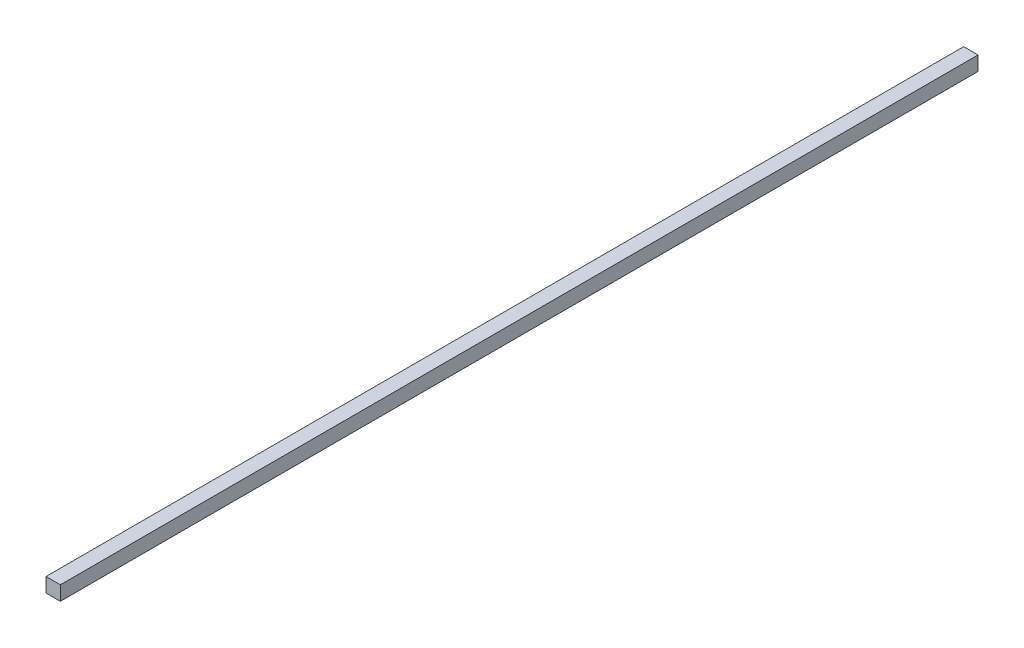
ISO-10303-21;
HEADER;
FILE_DESCRIPTION(('STEP AP214'),'2;1');
FILE_NAME('part.step','',(''),(''),'','','');
FILE_SCHEMA(('AUTOMOTIVE_DESIGN { 1 0 10303 214 1 1 1 1 }'));
ENDSEC;
DATA;
#1=APPLICATION_CONTEXT('core data for automotive mechanical design processes');
#2=APPLICATION_PROTOCOL_DEFINITION('international standard','automotive_design',2000,#1);
#3=PRODUCT_CONTEXT('',#1,'mechanical');
#4=PRODUCT('Part','Part','',(#3));
#5=PRODUCT_RELATED_PRODUCT_CATEGORY('part','',(#4));
#6=PRODUCT_DEFINITION_FORMATION('','',#4);
#7=PRODUCT_DEFINITION_CONTEXT('part definition',#1,'design');
#8=PRODUCT_DEFINITION('design','',#6,#7);
#9=PRODUCT_DEFINITION_SHAPE('','',#8);
#10=(LENGTH_UNIT() NAMED_UNIT(*) SI_UNIT(.MILLI.,.METRE.));
#11=(NAMED_UNIT(*) PLANE_ANGLE_UNIT() SI_UNIT($,.RADIAN.));
#12=(NAMED_UNIT(*) SI_UNIT($,.STERADIAN.) SOLID_ANGLE_UNIT());
#13=UNCERTAINTY_MEASURE_WITH_UNIT(LENGTH_MEASURE(1.E-05),#10,'distance_accuracy_value','');
#14=(GEOMETRIC_REPRESENTATION_CONTEXT(3) GLOBAL_UNCERTAINTY_ASSIGNED_CONTEXT((#13)) GLOBAL_UNIT_ASSIGNED_CONTEXT((#10,
#11,#12)) REPRESENTATION_CONTEXT('',''));
#15=CARTESIAN_POINT('',(0.,0.,0.));
#16=DIRECTION('',(0.,0.,1.));
#17=DIRECTION('',(1.,0.,0.));
#18=AXIS2_PLACEMENT_3D('',#15,#16,#17);
#19=CARTESIAN_POINT('',(-19.05,19.05,1219.2));
#20=DIRECTION('',(1.,0.,0.));
#21=DIRECTION('',(0.,1.,0.));
#22=AXIS2_PLACEMENT_3D('',#19,#20,#21);
#23=PLANE('',#22);
#24=DIRECTION('',(0.,-1.,0.));
#25=VECTOR('',#24,1.);
#26=CARTESIAN_POINT('',(-19.05,19.05,-1219.2));
#27=LINE('',#26,#25);
#28=CARTESIAN_POINT('',(-19.05,19.05,-1219.2));
#29=VERTEX_POINT('',#28);
#30=CARTESIAN_POINT('',(-19.05,-19.05,-1219.2));
#31=VERTEX_POINT('',#30);
#32=EDGE_CURVE('E96',#29,#31,#27,.T.);
#33=ORIENTED_EDGE('',*,*,#32,.T.);
#34=DIRECTION('',(0.,0.,-1.));
#35=VECTOR('',#34,1.);
#36=CARTESIAN_POINT('',(-19.05,-19.05,1219.2));
#37=LINE('',#36,#35);
#38=CARTESIAN_POINT('',(-19.05,-19.05,1219.2));
#39=VERTEX_POINT('',#38);
#40=EDGE_CURVE('E11',#39,#31,#37,.T.);
#41=ORIENTED_EDGE('',*,*,#40,.F.);
#42=DIRECTION('',(0.,-1.,0.));
#43=VECTOR('',#42,1.);
#44=CARTESIAN_POINT('',(-19.05,19.05,1219.2));
#45=LINE('',#44,#43);
#46=CARTESIAN_POINT('',(-19.05,19.05,1219.2));
#47=VERTEX_POINT('',#46);
#48=EDGE_CURVE('E84',#47,#39,#45,.T.);
#49=ORIENTED_EDGE('',*,*,#48,.F.);
#50=DIRECTION('',(0.,0.,-1.));
#51=VECTOR('',#50,1.);
#52=CARTESIAN_POINT('',(-19.05,19.05,1219.2));
#53=LINE('',#52,#51);
#54=EDGE_CURVE('E92',#47,#29,#53,.T.);
#55=ORIENTED_EDGE('',*,*,#54,.T.);
#56=EDGE_LOOP('',(#33,#41,#49,#55));
#57=FACE_BOUND('',#56,.T.);
#58=ADVANCED_FACE('F33',(#57),#23,.F.);
#59=CARTESIAN_POINT('',(-19.05,-19.05,1219.2));
#60=DIRECTION('',(0.,1.,0.));
#61=DIRECTION('',(0.,0.,1.));
#62=AXIS2_PLACEMENT_3D('',#59,#60,#61);
#63=PLANE('',#62);
#64=DIRECTION('',(1.,0.,0.));
#65=VECTOR('',#64,1.);
#66=CARTESIAN_POINT('',(-19.05,-19.05,-1219.2));
#67=LINE('',#66,#65);
#68=CARTESIAN_POINT('',(19.05,-19.05,-1219.2));
#69=VERTEX_POINT('',#68);
#70=EDGE_CURVE('E88',#31,#69,#67,.T.);
#71=ORIENTED_EDGE('',*,*,#70,.T.);
#72=DIRECTION('',(0.,0.,-1.));
#73=VECTOR('',#72,1.);
#74=CARTESIAN_POINT('',(19.05,-19.05,1219.2));
#75=LINE('',#74,#73);
#76=CARTESIAN_POINT('',(19.05,-19.05,1219.2));
#77=VERTEX_POINT('',#76);
#78=EDGE_CURVE('E41',#77,#69,#75,.T.);
#79=ORIENTED_EDGE('',*,*,#78,.F.);
#80=DIRECTION('',(1.,0.,0.));
#81=VECTOR('',#80,1.);
#82=CARTESIAN_POINT('',(-19.05,-19.05,1219.2));
#83=LINE('',#82,#81);
#84=EDGE_CURVE('E79',#39,#77,#83,.T.);
#85=ORIENTED_EDGE('',*,*,#84,.F.);
#86=ORIENTED_EDGE('',*,*,#40,.T.);
#87=EDGE_LOOP('',(#71,#79,#85,#86));
#88=FACE_BOUND('',#87,.T.);
#89=ADVANCED_FACE('F87',(#88),#63,.F.);
#90=CARTESIAN_POINT('',(19.05,19.05,1219.2));
#91=DIRECTION('',(-1.,0.,0.));
#92=DIRECTION('',(0.,-1.,0.));
#93=AXIS2_PLACEMENT_3D('',#90,#91,#92);
#94=PLANE('',#93);
#95=DIRECTION('',(0.,1.,0.));
#96=VECTOR('',#95,1.);
#97=CARTESIAN_POINT('',(19.05,19.05,-1219.2));
#98=LINE('',#97,#96);
#99=CARTESIAN_POINT('',(19.05,19.05,-1219.2));
#100=VERTEX_POINT('',#99);
#101=EDGE_CURVE('E66',#69,#100,#98,.T.);
#102=ORIENTED_EDGE('',*,*,#101,.T.);
#103=DIRECTION('',(0.,0.,-1.));
#104=VECTOR('',#103,1.);
#105=CARTESIAN_POINT('',(19.05,19.05,1219.2));
#106=LINE('',#105,#104);
#107=CARTESIAN_POINT('',(19.05,19.05,1219.2));
#108=VERTEX_POINT('',#107);
#109=EDGE_CURVE('E89',#108,#100,#106,.T.);
#110=ORIENTED_EDGE('',*,*,#109,.F.);
#111=DIRECTION('',(0.,1.,0.));
#112=VECTOR('',#111,1.);
#113=CARTESIAN_POINT('',(19.05,19.05,1219.2));
#114=LINE('',#113,#112);
#115=EDGE_CURVE('E82',#77,#108,#114,.T.);
#116=ORIENTED_EDGE('',*,*,#115,.F.);
#117=ORIENTED_EDGE('',*,*,#78,.T.);
#118=EDGE_LOOP('',(#102,#110,#116,#117));
#119=FACE_BOUND('',#118,.T.);
#120=ADVANCED_FACE('F90',(#119),#94,.F.);
#121=CARTESIAN_POINT('',(-19.05,19.05,1219.2));
#122=DIRECTION('',(0.,-1.,0.));
#123=DIRECTION('',(0.,0.,-1.));
#124=AXIS2_PLACEMENT_3D('',#121,#122,#123);
#125=PLANE('',#124);
#126=DIRECTION('',(-1.,0.,0.));
#127=VECTOR('',#126,1.);
#128=CARTESIAN_POINT('',(-19.05,19.05,-1219.2));
#129=LINE('',#128,#127);
#130=EDGE_CURVE('E72',#100,#29,#129,.T.);
#131=ORIENTED_EDGE('',*,*,#130,.T.);
#132=ORIENTED_EDGE('',*,*,#54,.F.);
#133=DIRECTION('',(-1.,0.,0.));
#134=VECTOR('',#133,1.);
#135=CARTESIAN_POINT('',(-19.05,19.05,1219.2));
#136=LINE('',#135,#134);
#137=EDGE_CURVE('E49',#108,#47,#136,.T.);
#138=ORIENTED_EDGE('',*,*,#137,.F.);
#139=ORIENTED_EDGE('',*,*,#109,.T.);
#140=EDGE_LOOP('',(#131,#132,#138,#139));
#141=FACE_BOUND('',#140,.T.);
#142=ADVANCED_FACE('F103',(#141),#125,.F.);
#143=CARTESIAN_POINT('',(-19.05,-19.05,1219.2));
#144=DIRECTION('',(0.,0.,1.));
#145=DIRECTION('',(1.,0.,0.));
#146=AXIS2_PLACEMENT_3D('',#143,#144,#145);
#147=PLANE('',#146);
#148=ORIENTED_EDGE('',*,*,#48,.T.);
#149=ORIENTED_EDGE('',*,*,#84,.T.);
#150=ORIENTED_EDGE('',*,*,#115,.T.);
#151=ORIENTED_EDGE('',*,*,#137,.T.);
#152=EDGE_LOOP('',(#148,#149,#150,#151));
#153=FACE_BOUND('',#152,.T.);
#154=ADVANCED_FACE('F80',(#153),#147,.T.);
#155=CARTESIAN_POINT('',(-19.05,-19.05,-1219.2));
#156=DIRECTION('',(0.,0.,1.));
#157=DIRECTION('',(1.,0.,0.));
#158=AXIS2_PLACEMENT_3D('',#155,#156,#157);
#159=PLANE('',#158);
#160=ORIENTED_EDGE('',*,*,#32,.F.);
#161=ORIENTED_EDGE('',*,*,#130,.F.);
#162=ORIENTED_EDGE('',*,*,#101,.F.);
#163=ORIENTED_EDGE('',*,*,#70,.F.);
#164=EDGE_LOOP('',(#160,#161,#162,#163));
#165=FACE_BOUND('',#164,.T.);
#166=ADVANCED_FACE('F106',(#165),#159,.F.);
#167=CLOSED_SHELL('',(#58,#89,#120,#142,#154,#166));
#168=MANIFOLD_SOLID_BREP('B2',#167);
#169=ADVANCED_BREP_SHAPE_REPRESENTATION('',(#18,#168),#14);
#170=SHAPE_DEFINITION_REPRESENTATION(#9,#169);
ENDSEC;
END-ISO-10303-21;
